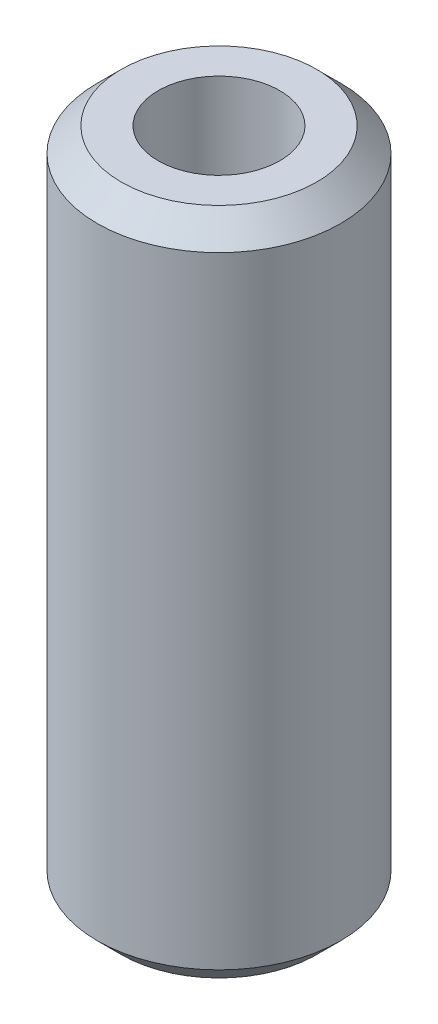
ISO-10303-21;
HEADER;
FILE_DESCRIPTION(('STEP AP214'),'2;1');
FILE_NAME('part.step','',(''),(''),'','','');
FILE_SCHEMA(('AUTOMOTIVE_DESIGN { 1 0 10303 214 1 1 1 1 }'));
ENDSEC;
DATA;
#1=APPLICATION_CONTEXT('core data for automotive mechanical design processes');
#2=APPLICATION_PROTOCOL_DEFINITION('international standard','automotive_design',2000,#1);
#3=PRODUCT_CONTEXT('',#1,'mechanical');
#4=PRODUCT('Part','Part','',(#3));
#5=PRODUCT_RELATED_PRODUCT_CATEGORY('part','',(#4));
#6=PRODUCT_DEFINITION_FORMATION('','',#4);
#7=PRODUCT_DEFINITION_CONTEXT('part definition',#1,'design');
#8=PRODUCT_DEFINITION('design','',#6,#7);
#9=PRODUCT_DEFINITION_SHAPE('','',#8);
#10=(LENGTH_UNIT() NAMED_UNIT(*) SI_UNIT(.MILLI.,.METRE.));
#11=(NAMED_UNIT(*) PLANE_ANGLE_UNIT() SI_UNIT($,.RADIAN.));
#12=(NAMED_UNIT(*) SI_UNIT($,.STERADIAN.) SOLID_ANGLE_UNIT());
#13=UNCERTAINTY_MEASURE_WITH_UNIT(LENGTH_MEASURE(1.E-05),#10,'distance_accuracy_value','');
#14=(GEOMETRIC_REPRESENTATION_CONTEXT(3) GLOBAL_UNCERTAINTY_ASSIGNED_CONTEXT((#13)) GLOBAL_UNIT_ASSIGNED_CONTEXT((#10,
#11,#12)) REPRESENTATION_CONTEXT('',''));
#15=CARTESIAN_POINT('',(0.,0.,0.));
#16=DIRECTION('',(0.,0.,1.));
#17=DIRECTION('',(1.,0.,0.));
#18=AXIS2_PLACEMENT_3D('',#15,#16,#17);
#19=CARTESIAN_POINT('',(0.,34.925,0.));
#20=DIRECTION('',(0.,1.,0.));
#21=DIRECTION('',(0.,0.,1.));
#22=AXIS2_PLACEMENT_3D('',#19,#20,#21);
#23=PLANE('',#22);
#24=CARTESIAN_POINT('',(0.,34.925,0.));
#25=DIRECTION('',(0.,1.,0.));
#26=DIRECTION('',(0.,0.,1.));
#27=AXIS2_PLACEMENT_3D('',#24,#25,#26);
#28=CIRCLE('',#27,10.2);
#29=CARTESIAN_POINT('',(0.,34.925,10.2));
#30=VERTEX_POINT('',#29);
#31=EDGE_CURVE('E10',#30,#30,#28,.T.);
#32=ORIENTED_EDGE('',*,*,#31,.T.);
#33=EDGE_LOOP('',(#32));
#34=FACE_BOUND('',#33,.T.);
#35=CARTESIAN_POINT('',(0.,34.925,0.));
#36=DIRECTION('',(0.,1.,0.));
#37=DIRECTION('',(0.,0.,1.));
#38=AXIS2_PLACEMENT_3D('',#35,#36,#37);
#39=CIRCLE('',#38,6.35);
#40=CARTESIAN_POINT('',(0.,34.925,6.35));
#41=VERTEX_POINT('',#40);
#42=EDGE_CURVE('E53',#41,#41,#39,.T.);
#43=ORIENTED_EDGE('',*,*,#42,.F.);
#44=EDGE_LOOP('',(#43));
#45=FACE_BOUND('',#44,.T.);
#46=ADVANCED_FACE('F32',(#34,#45),#23,.T.);
#47=CARTESIAN_POINT('',(0.,-34.925,0.));
#48=DIRECTION('',(0.,1.,0.));
#49=DIRECTION('',(0.,0.,1.));
#50=AXIS2_PLACEMENT_3D('',#47,#48,#49);
#51=PLANE('',#50);
#52=CARTESIAN_POINT('',(0.,-34.925,0.));
#53=DIRECTION('',(0.,1.,0.));
#54=DIRECTION('',(0.,0.,1.));
#55=AXIS2_PLACEMENT_3D('',#52,#53,#54);
#56=CIRCLE('',#55,10.2);
#57=CARTESIAN_POINT('',(0.,-34.925,10.2));
#58=VERTEX_POINT('',#57);
#59=EDGE_CURVE('E40',#58,#58,#56,.F.);
#60=ORIENTED_EDGE('',*,*,#59,.T.);
#61=EDGE_LOOP('',(#60));
#62=FACE_BOUND('',#61,.T.);
#63=CARTESIAN_POINT('',(0.,-34.925,0.));
#64=DIRECTION('',(0.,1.,0.));
#65=DIRECTION('',(0.,0.,1.));
#66=AXIS2_PLACEMENT_3D('',#63,#64,#65);
#67=CIRCLE('',#66,6.35);
#68=CARTESIAN_POINT('',(0.,-34.925,6.35));
#69=VERTEX_POINT('',#68);
#70=EDGE_CURVE('E54',#69,#69,#67,.T.);
#71=ORIENTED_EDGE('',*,*,#70,.T.);
#72=EDGE_LOOP('',(#71));
#73=FACE_BOUND('',#72,.T.);
#74=ADVANCED_FACE('F64',(#62,#73),#51,.F.);
#75=CARTESIAN_POINT('',(0.,34.925,0.));
#76=DIRECTION('',(0.,-1.,0.));
#77=DIRECTION('',(0.,0.,-1.));
#78=AXIS2_PLACEMENT_3D('',#75,#76,#77);
#79=CYLINDRICAL_SURFACE('',#78,12.7);
#80=CARTESIAN_POINT('',(0.,-32.425,0.));
#81=DIRECTION('',(0.,1.,0.));
#82=DIRECTION('',(0.,0.,1.));
#83=AXIS2_PLACEMENT_3D('',#80,#81,#82);
#84=CIRCLE('',#83,12.7);
#85=CARTESIAN_POINT('',(0.,-32.425,12.7));
#86=VERTEX_POINT('',#85);
#87=EDGE_CURVE('E44',#86,#86,#84,.T.);
#88=ORIENTED_EDGE('',*,*,#87,.T.);
#89=EDGE_LOOP('',(#88));
#90=FACE_BOUND('',#89,.T.);
#91=CARTESIAN_POINT('',(0.,32.425,0.));
#92=DIRECTION('',(0.,1.,0.));
#93=DIRECTION('',(0.,0.,1.));
#94=AXIS2_PLACEMENT_3D('',#91,#92,#93);
#95=CIRCLE('',#94,12.7);
#96=CARTESIAN_POINT('',(0.,32.425,12.7));
#97=VERTEX_POINT('',#96);
#98=EDGE_CURVE('E48',#97,#97,#95,.F.);
#99=ORIENTED_EDGE('',*,*,#98,.T.);
#100=EDGE_LOOP('',(#99));
#101=FACE_BOUND('',#100,.T.);
#102=ADVANCED_FACE('F69',(#90,#101),#79,.T.);
#103=CARTESIAN_POINT('',(0.,34.925,0.));
#104=DIRECTION('',(0.,-1.,0.));
#105=DIRECTION('',(0.,0.,-1.));
#106=AXIS2_PLACEMENT_3D('',#103,#104,#105);
#107=CYLINDRICAL_SURFACE('',#106,6.35);
#108=ORIENTED_EDGE('',*,*,#42,.T.);
#109=EDGE_LOOP('',(#108));
#110=FACE_BOUND('',#109,.T.);
#111=ORIENTED_EDGE('',*,*,#70,.F.);
#112=EDGE_LOOP('',(#111));
#113=FACE_BOUND('',#112,.T.);
#114=ADVANCED_FACE('F60',(#110,#113),#107,.F.);
#115=CARTESIAN_POINT('',(0.,-32.425,0.));
#116=DIRECTION('',(0.,1.,0.));
#117=DIRECTION('',(0.,0.,1.));
#118=AXIS2_PLACEMENT_3D('',#115,#116,#117);
#119=CONICAL_SURFACE('',#118,12.7,0.785398163397449);
#120=ORIENTED_EDGE('',*,*,#59,.F.);
#121=EDGE_LOOP('',(#120));
#122=FACE_BOUND('',#121,.T.);
#123=ORIENTED_EDGE('',*,*,#87,.F.);
#124=EDGE_LOOP('',(#123));
#125=FACE_BOUND('',#124,.T.);
#126=ADVANCED_FACE('F76',(#122,#125),#119,.T.);
#127=CARTESIAN_POINT('',(0.,34.925,0.));
#128=DIRECTION('',(0.,-1.,0.));
#129=DIRECTION('',(0.,0.,-1.));
#130=AXIS2_PLACEMENT_3D('',#127,#128,#129);
#131=CONICAL_SURFACE('',#130,10.2,0.785398163397446);
#132=ORIENTED_EDGE('',*,*,#98,.F.);
#133=EDGE_LOOP('',(#132));
#134=FACE_BOUND('',#133,.T.);
#135=ORIENTED_EDGE('',*,*,#31,.F.);
#136=EDGE_LOOP('',(#135));
#137=FACE_BOUND('',#136,.T.);
#138=ADVANCED_FACE('F35',(#134,#137),#131,.T.);
#139=CLOSED_SHELL('',(#46,#74,#102,#114,#126,#138));
#140=MANIFOLD_SOLID_BREP('B2',#139);
#141=ADVANCED_BREP_SHAPE_REPRESENTATION('',(#18,#140),#14);
#142=SHAPE_DEFINITION_REPRESENTATION(#9,#141);
ENDSEC;
END-ISO-10303-21;
